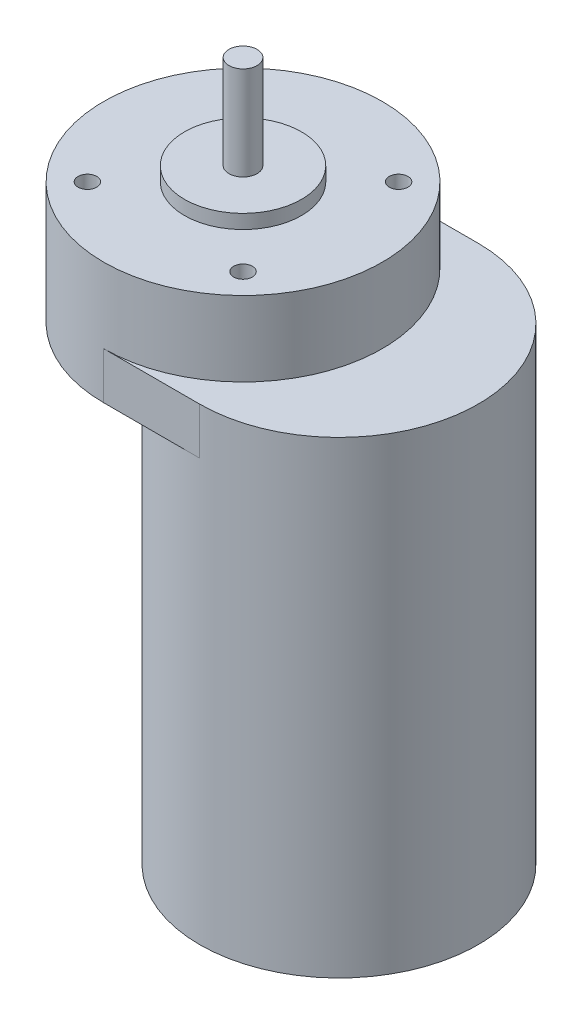
ISO-10303-21;
HEADER;
FILE_DESCRIPTION(('STEP AP214'),'2;1');
FILE_NAME('part.step','',(''),(''),'','','');
FILE_SCHEMA(('AUTOMOTIVE_DESIGN { 1 0 10303 214 1 1 1 1 }'));
ENDSEC;
DATA;
#1=APPLICATION_CONTEXT('core data for automotive mechanical design processes');
#2=APPLICATION_PROTOCOL_DEFINITION('international standard','automotive_design',2000,#1);
#3=PRODUCT_CONTEXT('',#1,'mechanical');
#4=PRODUCT('Part','Part','',(#3));
#5=PRODUCT_RELATED_PRODUCT_CATEGORY('part','',(#4));
#6=PRODUCT_DEFINITION_FORMATION('','',#4);
#7=PRODUCT_DEFINITION_CONTEXT('part definition',#1,'design');
#8=PRODUCT_DEFINITION('design','',#6,#7);
#9=PRODUCT_DEFINITION_SHAPE('','',#8);
#10=(LENGTH_UNIT() NAMED_UNIT(*) SI_UNIT(.MILLI.,.METRE.));
#11=(NAMED_UNIT(*) PLANE_ANGLE_UNIT() SI_UNIT($,.RADIAN.));
#12=(NAMED_UNIT(*) SI_UNIT($,.STERADIAN.) SOLID_ANGLE_UNIT());
#13=UNCERTAINTY_MEASURE_WITH_UNIT(LENGTH_MEASURE(1.E-05),#10,'distance_accuracy_value','');
#14=(GEOMETRIC_REPRESENTATION_CONTEXT(3) GLOBAL_UNCERTAINTY_ASSIGNED_CONTEXT((#13)) GLOBAL_UNIT_ASSIGNED_CONTEXT((#10,
#11,#12)) REPRESENTATION_CONTEXT('',''));
#15=CARTESIAN_POINT('',(0.,0.,0.));
#16=DIRECTION('',(0.,0.,1.));
#17=DIRECTION('',(1.,0.,0.));
#18=AXIS2_PLACEMENT_3D('',#15,#16,#17);
#19=CARTESIAN_POINT('',(-20.5,139.,0.));
#20=DIRECTION('',(0.,-1.,0.));
#21=DIRECTION('',(0.,0.,-1.));
#22=AXIS2_PLACEMENT_3D('',#19,#20,#21);
#23=CYLINDRICAL_SURFACE('',#22,3.);
#24=CARTESIAN_POINT('',(-20.5,139.,0.));
#25=DIRECTION('',(0.,1.,0.));
#26=DIRECTION('',(0.,0.,1.));
#27=AXIS2_PLACEMENT_3D('',#24,#25,#26);
#28=CIRCLE('',#27,3.);
#29=CARTESIAN_POINT('',(-20.5,139.,2.99999999999999));
#30=VERTEX_POINT('',#29);
#31=EDGE_CURVE('E11',#30,#30,#28,.T.);
#32=ORIENTED_EDGE('',*,*,#31,.F.);
#33=EDGE_LOOP('',(#32));
#34=FACE_BOUND('',#33,.T.);
#35=CARTESIAN_POINT('',(-20.5,119.,0.));
#36=DIRECTION('',(0.,1.,0.));
#37=DIRECTION('',(0.,0.,1.));
#38=AXIS2_PLACEMENT_3D('',#35,#36,#37);
#39=CIRCLE('',#38,3.);
#40=CARTESIAN_POINT('',(-20.5,119.,2.99999999999999));
#41=VERTEX_POINT('',#40);
#42=EDGE_CURVE('E49',#41,#41,#39,.T.);
#43=ORIENTED_EDGE('',*,*,#42,.T.);
#44=EDGE_LOOP('',(#43));
#45=FACE_BOUND('',#44,.T.);
#46=ADVANCED_FACE('F46',(#34,#45),#23,.T.);
#47=CARTESIAN_POINT('',(-20.5,139.,0.));
#48=DIRECTION('',(0.,1.,0.));
#49=DIRECTION('',(0.,0.,1.));
#50=AXIS2_PLACEMENT_3D('',#47,#48,#49);
#51=PLANE('',#50);
#52=ORIENTED_EDGE('',*,*,#31,.T.);
#53=EDGE_LOOP('',(#52));
#54=FACE_BOUND('',#53,.T.);
#55=ADVANCED_FACE('F61',(#54),#51,.T.);
#56=CARTESIAN_POINT('',(-20.5,119.,0.));
#57=DIRECTION('',(0.,1.,0.));
#58=DIRECTION('',(0.,0.,1.));
#59=AXIS2_PLACEMENT_3D('',#56,#57,#58);
#60=PLANE('',#59);
#61=ORIENTED_EDGE('',*,*,#42,.F.);
#62=EDGE_LOOP('',(#61));
#63=FACE_BOUND('',#62,.T.);
#64=ADVANCED_FACE('F59',(#63),#60,.F.);
#65=CLOSED_SHELL('',(#46,#55,#64));
#66=MANIFOLD_SOLID_BREP('B2',#65);
#67=CARTESIAN_POINT('',(0.,90.,0.));
#68=DIRECTION('',(0.,-1.,0.));
#69=DIRECTION('',(0.,0.,-1.));
#70=AXIS2_PLACEMENT_3D('',#67,#68,#69);
#71=CYLINDRICAL_SURFACE('',#70,29.75);
#72=CARTESIAN_POINT('',(0.,90.,0.));
#73=DIRECTION('',(0.,1.,0.));
#74=DIRECTION('',(0.,0.,1.));
#75=AXIS2_PLACEMENT_3D('',#72,#73,#74);
#76=CIRCLE('',#75,29.75);
#77=CARTESIAN_POINT('',(0.,90.,-29.75));
#78=VERTEX_POINT('',#77);
#79=CARTESIAN_POINT('',(0.,90.,29.75));
#80=VERTEX_POINT('',#79);
#81=EDGE_CURVE('E94',#78,#80,#76,.T.);
#82=ORIENTED_EDGE('',*,*,#81,.F.);
#83=DIRECTION('',(0.,-1.,0.));
#84=VECTOR('',#83,1.);
#85=CARTESIAN_POINT('',(0.,100.,-29.75));
#86=LINE('',#85,#84);
#87=CARTESIAN_POINT('',(0.,100.,-29.75));
#88=VERTEX_POINT('',#87);
#89=EDGE_CURVE('E171',#88,#78,#86,.T.);
#90=ORIENTED_EDGE('',*,*,#89,.F.);
#91=CARTESIAN_POINT('',(0.,100.,0.));
#92=DIRECTION('',(0.,1.,0.));
#93=DIRECTION('',(0.,0.,1.));
#94=AXIS2_PLACEMENT_3D('',#91,#92,#93);
#95=CIRCLE('',#94,29.75);
#96=CARTESIAN_POINT('',(0.,100.,29.75));
#97=VERTEX_POINT('',#96);
#98=EDGE_CURVE('E162',#97,#88,#95,.T.);
#99=ORIENTED_EDGE('',*,*,#98,.F.);
#100=DIRECTION('',(0.,-1.,0.));
#101=VECTOR('',#100,1.);
#102=CARTESIAN_POINT('',(0.,100.,29.75));
#103=LINE('',#102,#101);
#104=EDGE_CURVE('E138',#97,#80,#103,.T.);
#105=ORIENTED_EDGE('',*,*,#104,.T.);
#106=EDGE_LOOP('',(#82,#90,#99,#105));
#107=FACE_BOUND('',#106,.T.);
#108=CARTESIAN_POINT('',(0.,0.,0.));
#109=DIRECTION('',(0.,1.,0.));
#110=DIRECTION('',(0.,0.,1.));
#111=AXIS2_PLACEMENT_3D('',#108,#109,#110);
#112=CIRCLE('',#111,29.75);
#113=CARTESIAN_POINT('',(0.,0.,29.75));
#114=VERTEX_POINT('',#113);
#115=EDGE_CURVE('E89',#114,#114,#112,.T.);
#116=ORIENTED_EDGE('',*,*,#115,.T.);
#117=EDGE_LOOP('',(#116));
#118=FACE_BOUND('',#117,.T.);
#119=ADVANCED_FACE('F86',(#107,#118),#71,.T.);
#120=CARTESIAN_POINT('',(0.,0.,0.));
#121=DIRECTION('',(0.,1.,0.));
#122=DIRECTION('',(0.,0.,1.));
#123=AXIS2_PLACEMENT_3D('',#120,#121,#122);
#124=PLANE('',#123);
#125=ORIENTED_EDGE('',*,*,#115,.F.);
#126=EDGE_LOOP('',(#125));
#127=FACE_BOUND('',#126,.T.);
#128=ADVANCED_FACE('F176',(#127),#124,.F.);
#129=CARTESIAN_POINT('',(0.,90.,0.));
#130=DIRECTION('',(0.,1.,0.));
#131=DIRECTION('',(0.,0.,1.));
#132=AXIS2_PLACEMENT_3D('',#129,#130,#131);
#133=PLANE('',#132);
#134=DIRECTION('',(-1.,0.,0.));
#135=VECTOR('',#134,1.);
#136=CARTESIAN_POINT('',(0.,90.,-29.75));
#137=LINE('',#136,#135);
#138=CARTESIAN_POINT('',(-20.5,90.,-29.75));
#139=VERTEX_POINT('',#138);
#140=EDGE_CURVE('E156',#78,#139,#137,.T.);
#141=ORIENTED_EDGE('',*,*,#140,.F.);
#142=ORIENTED_EDGE('',*,*,#81,.T.);
#143=DIRECTION('',(1.,0.,0.));
#144=VECTOR('',#143,1.);
#145=CARTESIAN_POINT('',(0.,90.,29.75));
#146=LINE('',#145,#144);
#147=CARTESIAN_POINT('',(-20.5,90.,29.75));
#148=VERTEX_POINT('',#147);
#149=EDGE_CURVE('E164',#148,#80,#146,.T.);
#150=ORIENTED_EDGE('',*,*,#149,.F.);
#151=CARTESIAN_POINT('',(-20.5,90.,0.));
#152=DIRECTION('',(0.,1.,0.));
#153=DIRECTION('',(0.,0.,1.));
#154=AXIS2_PLACEMENT_3D('',#151,#152,#153);
#155=CIRCLE('',#154,29.75);
#156=EDGE_CURVE('E148',#139,#148,#155,.T.);
#157=ORIENTED_EDGE('',*,*,#156,.F.);
#158=EDGE_LOOP('',(#141,#142,#150,#157));
#159=FACE_BOUND('',#158,.T.);
#160=ADVANCED_FACE('F178',(#159),#133,.F.);
#161=CARTESIAN_POINT('',(0.,100.,-29.75));
#162=DIRECTION('',(0.,0.,1.));
#163=DIRECTION('',(1.,0.,0.));
#164=AXIS2_PLACEMENT_3D('',#161,#162,#163);
#165=PLANE('',#164);
#166=ORIENTED_EDGE('',*,*,#140,.T.);
#167=DIRECTION('',(0.,-1.,0.));
#168=VECTOR('',#167,1.);
#169=CARTESIAN_POINT('',(-20.5,100.,-29.75));
#170=LINE('',#169,#168);
#171=CARTESIAN_POINT('',(-20.5,100.,-29.75));
#172=VERTEX_POINT('',#171);
#173=EDGE_CURVE('E149',#172,#139,#170,.T.);
#174=ORIENTED_EDGE('',*,*,#173,.F.);
#175=DIRECTION('',(-1.,0.,0.));
#176=VECTOR('',#175,1.);
#177=CARTESIAN_POINT('',(0.,100.,-29.75));
#178=LINE('',#177,#176);
#179=EDGE_CURVE('E131',#88,#172,#178,.T.);
#180=ORIENTED_EDGE('',*,*,#179,.F.);
#181=ORIENTED_EDGE('',*,*,#89,.T.);
#182=EDGE_LOOP('',(#166,#174,#180,#181));
#183=FACE_BOUND('',#182,.T.);
#184=ADVANCED_FACE('F183',(#183),#165,.F.);
#185=CARTESIAN_POINT('',(-20.5,100.,0.));
#186=DIRECTION('',(0.,-1.,0.));
#187=DIRECTION('',(0.,0.,-1.));
#188=AXIS2_PLACEMENT_3D('',#185,#186,#187);
#189=CYLINDRICAL_SURFACE('',#188,29.75);
#190=ORIENTED_EDGE('',*,*,#156,.T.);
#191=DIRECTION('',(0.,-1.,0.));
#192=VECTOR('',#191,1.);
#193=CARTESIAN_POINT('',(-20.5,100.,29.75));
#194=LINE('',#193,#192);
#195=CARTESIAN_POINT('',(-20.5,100.,29.75));
#196=VERTEX_POINT('',#195);
#197=EDGE_CURVE('E137',#196,#148,#194,.T.);
#198=ORIENTED_EDGE('',*,*,#197,.F.);
#199=CARTESIAN_POINT('',(-20.5,100.,0.));
#200=DIRECTION('',(0.,1.,0.));
#201=DIRECTION('',(0.,0.,1.));
#202=AXIS2_PLACEMENT_3D('',#199,#200,#201);
#203=CIRCLE('',#202,29.75);
#204=EDGE_CURVE('E146',#196,#172,#203,.T.);
#205=ORIENTED_EDGE('',*,*,#204,.T.);
#206=ORIENTED_EDGE('',*,*,#173,.T.);
#207=EDGE_LOOP('',(#190,#198,#205,#206));
#208=FACE_BOUND('',#207,.T.);
#209=CARTESIAN_POINT('',(-20.5,116.,0.));
#210=DIRECTION('',(0.,1.,0.));
#211=DIRECTION('',(0.,0.,1.));
#212=AXIS2_PLACEMENT_3D('',#209,#210,#211);
#213=CIRCLE('',#212,29.75);
#214=CARTESIAN_POINT('',(-20.5,116.,29.75));
#215=VERTEX_POINT('',#214);
#216=EDGE_CURVE('E152',#215,#215,#213,.T.);
#217=ORIENTED_EDGE('',*,*,#216,.F.);
#218=EDGE_LOOP('',(#217));
#219=FACE_BOUND('',#218,.T.);
#220=ADVANCED_FACE('F143',(#208,#219),#189,.T.);
#221=CARTESIAN_POINT('',(0.,100.,29.75));
#222=DIRECTION('',(0.,0.,-1.));
#223=DIRECTION('',(-1.,0.,0.));
#224=AXIS2_PLACEMENT_3D('',#221,#222,#223);
#225=PLANE('',#224);
#226=ORIENTED_EDGE('',*,*,#149,.T.);
#227=ORIENTED_EDGE('',*,*,#104,.F.);
#228=DIRECTION('',(1.,0.,0.));
#229=VECTOR('',#228,1.);
#230=CARTESIAN_POINT('',(0.,100.,29.75));
#231=LINE('',#230,#229);
#232=EDGE_CURVE('E110',#196,#97,#231,.T.);
#233=ORIENTED_EDGE('',*,*,#232,.F.);
#234=ORIENTED_EDGE('',*,*,#197,.T.);
#235=EDGE_LOOP('',(#226,#227,#233,#234));
#236=FACE_BOUND('',#235,.T.);
#237=ADVANCED_FACE('F136',(#236),#225,.F.);
#238=CARTESIAN_POINT('',(0.,100.,0.));
#239=DIRECTION('',(0.,1.,0.));
#240=DIRECTION('',(0.,0.,1.));
#241=AXIS2_PLACEMENT_3D('',#238,#239,#240);
#242=PLANE('',#241);
#243=ORIENTED_EDGE('',*,*,#204,.F.);
#244=ORIENTED_EDGE('',*,*,#232,.T.);
#245=ORIENTED_EDGE('',*,*,#98,.T.);
#246=ORIENTED_EDGE('',*,*,#179,.T.);
#247=EDGE_LOOP('',(#243,#244,#245,#246));
#248=FACE_BOUND('',#247,.T.);
#249=ADVANCED_FACE('F151',(#248),#242,.T.);
#250=CARTESIAN_POINT('',(-20.5,116.,0.));
#251=DIRECTION('',(0.,1.,0.));
#252=DIRECTION('',(0.,0.,1.));
#253=AXIS2_PLACEMENT_3D('',#250,#251,#252);
#254=PLANE('',#253);
#255=CARTESIAN_POINT('',(-3.88299064211628,116.,-16.6170093578845));
#256=DIRECTION('',(0.,1.,0.));
#257=DIRECTION('',(0.,0.,1.));
#258=AXIS2_PLACEMENT_3D('',#255,#256,#257);
#259=CIRCLE('',#258,2.);
#260=CARTESIAN_POINT('',(-3.88299064211628,116.,-14.6170093578845));
#261=VERTEX_POINT('',#260);
#262=EDGE_CURVE('E265',#261,#261,#259,.T.);
#263=ORIENTED_EDGE('',*,*,#262,.F.);
#264=EDGE_LOOP('',(#263));
#265=FACE_BOUND('',#264,.T.);
#266=CARTESIAN_POINT('',(-3.88299064211558,116.,16.6170093578833));
#267=DIRECTION('',(0.,1.,0.));
#268=DIRECTION('',(0.,0.,1.));
#269=AXIS2_PLACEMENT_3D('',#266,#267,#268);
#270=CIRCLE('',#269,2.00000000000001);
#271=CARTESIAN_POINT('',(-3.88299064211558,116.,18.6170093578833));
#272=VERTEX_POINT('',#271);
#273=EDGE_CURVE('E259',#272,#272,#270,.T.);
#274=ORIENTED_EDGE('',*,*,#273,.F.);
#275=EDGE_LOOP('',(#274));
#276=FACE_BOUND('',#275,.T.);
#277=CARTESIAN_POINT('',(-37.1170093578834,116.,16.6170093578839));
#278=DIRECTION('',(0.,1.,0.));
#279=DIRECTION('',(0.,0.,1.));
#280=AXIS2_PLACEMENT_3D('',#277,#278,#279);
#281=CIRCLE('',#280,2.);
#282=CARTESIAN_POINT('',(-37.1170093578834,116.,18.6170093578839));
#283=VERTEX_POINT('',#282);
#284=EDGE_CURVE('E248',#283,#283,#281,.T.);
#285=ORIENTED_EDGE('',*,*,#284,.F.);
#286=EDGE_LOOP('',(#285));
#287=FACE_BOUND('',#286,.T.);
#288=CARTESIAN_POINT('',(-37.1170093578838,116.,-16.6170093578839));
#289=DIRECTION('',(0.,1.,0.));
#290=DIRECTION('',(0.,0.,1.));
#291=AXIS2_PLACEMENT_3D('',#288,#289,#290);
#292=CIRCLE('',#291,2.);
#293=CARTESIAN_POINT('',(-37.1170093578838,116.,-14.6170093578839));
#294=VERTEX_POINT('',#293);
#295=EDGE_CURVE('E247',#294,#294,#292,.T.);
#296=ORIENTED_EDGE('',*,*,#295,.F.);
#297=EDGE_LOOP('',(#296));
#298=FACE_BOUND('',#297,.T.);
#299=CARTESIAN_POINT('',(-20.5,116.,0.));
#300=DIRECTION('',(0.,1.,0.));
#301=DIRECTION('',(0.,0.,1.));
#302=AXIS2_PLACEMENT_3D('',#299,#300,#301);
#303=CIRCLE('',#302,12.5);
#304=CARTESIAN_POINT('',(-20.5,116.,12.5));
#305=VERTEX_POINT('',#304);
#306=EDGE_CURVE('E44',#305,#305,#303,.T.);
#307=ORIENTED_EDGE('',*,*,#306,.F.);
#308=EDGE_LOOP('',(#307));
#309=FACE_BOUND('',#308,.T.);
#310=ORIENTED_EDGE('',*,*,#216,.T.);
#311=EDGE_LOOP('',(#310));
#312=FACE_BOUND('',#311,.T.);
#313=ADVANCED_FACE('F194',(#265,#276,#287,#298,#309,#312),#254,.T.);
#314=CARTESIAN_POINT('',(-20.5,119.,0.));
#315=DIRECTION('',(0.,1.,0.));
#316=DIRECTION('',(0.,0.,1.));
#317=AXIS2_PLACEMENT_3D('',#314,#315,#316);
#318=PLANE('',#317);
#319=CARTESIAN_POINT('',(-20.5,119.,0.));
#320=DIRECTION('',(0.,1.,0.));
#321=DIRECTION('',(0.,0.,1.));
#322=AXIS2_PLACEMENT_3D('',#319,#320,#321);
#323=CIRCLE('',#322,12.5);
#324=CARTESIAN_POINT('',(-20.5,119.,12.5));
#325=VERTEX_POINT('',#324);
#326=EDGE_CURVE('E153',#325,#325,#323,.T.);
#327=ORIENTED_EDGE('',*,*,#326,.T.);
#328=EDGE_LOOP('',(#327));
#329=FACE_BOUND('',#328,.T.);
#330=CARTESIAN_POINT('',(-20.5,119.,0.));
#331=DIRECTION('',(0.,1.,0.));
#332=DIRECTION('',(0.,0.,1.));
#333=AXIS2_PLACEMENT_3D('',#330,#331,#332);
#334=CIRCLE('',#333,3.);
#335=CARTESIAN_POINT('',(-20.5,119.,2.99999999999999));
#336=VERTEX_POINT('',#335);
#337=EDGE_CURVE('E159',#336,#336,#334,.T.);
#338=ORIENTED_EDGE('',*,*,#337,.F.);
#339=EDGE_LOOP('',(#338));
#340=FACE_BOUND('',#339,.T.);
#341=ADVANCED_FACE('F197',(#329,#340),#318,.T.);
#342=CARTESIAN_POINT('',(-20.5,119.,0.));
#343=DIRECTION('',(0.,-1.,0.));
#344=DIRECTION('',(0.,0.,-1.));
#345=AXIS2_PLACEMENT_3D('',#342,#343,#344);
#346=CYLINDRICAL_SURFACE('',#345,12.5);
#347=ORIENTED_EDGE('',*,*,#326,.F.);
#348=EDGE_LOOP('',(#347));
#349=FACE_BOUND('',#348,.T.);
#350=ORIENTED_EDGE('',*,*,#306,.T.);
#351=EDGE_LOOP('',(#350));
#352=FACE_BOUND('',#351,.T.);
#353=ADVANCED_FACE('F200',(#349,#352),#346,.T.);
#354=CARTESIAN_POINT('',(-20.5,119.,0.));
#355=DIRECTION('',(0.,-1.,0.));
#356=DIRECTION('',(0.,0.,-1.));
#357=AXIS2_PLACEMENT_3D('',#354,#355,#356);
#358=CYLINDRICAL_SURFACE('',#357,3.);
#359=ORIENTED_EDGE('',*,*,#337,.T.);
#360=EDGE_LOOP('',(#359));
#361=FACE_BOUND('',#360,.T.);
#362=CARTESIAN_POINT('',(-20.5,116.,0.));
#363=DIRECTION('',(0.,1.,0.));
#364=DIRECTION('',(0.,0.,1.));
#365=AXIS2_PLACEMENT_3D('',#362,#363,#364);
#366=CIRCLE('',#365,3.);
#367=CARTESIAN_POINT('',(-20.5,116.,2.99999999999999));
#368=VERTEX_POINT('',#367);
#369=EDGE_CURVE('E269',#368,#368,#366,.T.);
#370=ORIENTED_EDGE('',*,*,#369,.F.);
#371=EDGE_LOOP('',(#370));
#372=FACE_BOUND('',#371,.T.);
#373=ADVANCED_FACE('F203',(#361,#372),#358,.F.);
#374=ORIENTED_EDGE('',*,*,#369,.T.);
#375=EDGE_LOOP('',(#374));
#376=FACE_BOUND('',#375,.T.);
#377=ADVANCED_FACE('F199',(#376),#254,.T.);
#378=CARTESIAN_POINT('',(-37.1170093578838,96.,-16.6170093578839));
#379=DIRECTION('',(0.,1.,0.));
#380=DIRECTION('',(0.,0.,1.));
#381=AXIS2_PLACEMENT_3D('',#378,#379,#380);
#382=CYLINDRICAL_SURFACE('',#381,2.);
#383=CARTESIAN_POINT('',(-37.1170093578838,96.,-16.6170093578839));
#384=DIRECTION('',(0.,1.,0.));
#385=DIRECTION('',(0.,0.,1.));
#386=AXIS2_PLACEMENT_3D('',#383,#384,#385);
#387=CIRCLE('',#386,2.);
#388=CARTESIAN_POINT('',(-37.1170093578838,96.,-14.6170093578839));
#389=VERTEX_POINT('',#388);
#390=EDGE_CURVE('E251',#389,#389,#387,.T.);
#391=ORIENTED_EDGE('',*,*,#390,.F.);
#392=EDGE_LOOP('',(#391));
#393=FACE_BOUND('',#392,.T.);
#394=ORIENTED_EDGE('',*,*,#295,.T.);
#395=EDGE_LOOP('',(#394));
#396=FACE_BOUND('',#395,.T.);
#397=ADVANCED_FACE('F211',(#393,#396),#382,.F.);
#398=CARTESIAN_POINT('',(-37.1170093578838,96.,-16.6170093578839));
#399=DIRECTION('',(0.,1.,0.));
#400=DIRECTION('',(0.,0.,1.));
#401=AXIS2_PLACEMENT_3D('',#398,#399,#400);
#402=PLANE('',#401);
#403=ORIENTED_EDGE('',*,*,#390,.T.);
#404=EDGE_LOOP('',(#403));
#405=FACE_BOUND('',#404,.T.);
#406=ADVANCED_FACE('F214',(#405),#402,.T.);
#407=CARTESIAN_POINT('',(-37.1170093578834,96.,16.6170093578839));
#408=DIRECTION('',(0.,1.,0.));
#409=DIRECTION('',(0.,0.,1.));
#410=AXIS2_PLACEMENT_3D('',#407,#408,#409);
#411=CYLINDRICAL_SURFACE('',#410,2.);
#412=CARTESIAN_POINT('',(-37.1170093578834,96.,16.6170093578839));
#413=DIRECTION('',(0.,1.,0.));
#414=DIRECTION('',(0.,0.,1.));
#415=AXIS2_PLACEMENT_3D('',#412,#413,#414);
#416=CIRCLE('',#415,2.);
#417=CARTESIAN_POINT('',(-37.1170093578834,96.,18.6170093578839));
#418=VERTEX_POINT('',#417);
#419=EDGE_CURVE('E246',#418,#418,#416,.T.);
#420=ORIENTED_EDGE('',*,*,#419,.F.);
#421=EDGE_LOOP('',(#420));
#422=FACE_BOUND('',#421,.T.);
#423=ORIENTED_EDGE('',*,*,#284,.T.);
#424=EDGE_LOOP('',(#423));
#425=FACE_BOUND('',#424,.T.);
#426=ADVANCED_FACE('F218',(#422,#425),#411,.F.);
#427=CARTESIAN_POINT('',(-37.1170093578834,96.,16.6170093578839));
#428=DIRECTION('',(0.,1.,0.));
#429=DIRECTION('',(0.,0.,1.));
#430=AXIS2_PLACEMENT_3D('',#427,#428,#429);
#431=PLANE('',#430);
#432=ORIENTED_EDGE('',*,*,#419,.T.);
#433=EDGE_LOOP('',(#432));
#434=FACE_BOUND('',#433,.T.);
#435=ADVANCED_FACE('F232',(#434),#431,.T.);
#436=CARTESIAN_POINT('',(-3.88299064211558,96.,16.6170093578833));
#437=DIRECTION('',(0.,1.,0.));
#438=DIRECTION('',(0.,0.,1.));
#439=AXIS2_PLACEMENT_3D('',#436,#437,#438);
#440=CYLINDRICAL_SURFACE('',#439,2.00000000000001);
#441=CARTESIAN_POINT('',(-3.88299064211558,96.,16.6170093578833));
#442=DIRECTION('',(0.,1.,0.));
#443=DIRECTION('',(0.,0.,1.));
#444=AXIS2_PLACEMENT_3D('',#441,#442,#443);
#445=CIRCLE('',#444,2.00000000000001);
#446=CARTESIAN_POINT('',(-3.88299064211558,96.,18.6170093578833));
#447=VERTEX_POINT('',#446);
#448=EDGE_CURVE('E254',#447,#447,#445,.T.);
#449=ORIENTED_EDGE('',*,*,#448,.F.);
#450=EDGE_LOOP('',(#449));
#451=FACE_BOUND('',#450,.T.);
#452=ORIENTED_EDGE('',*,*,#273,.T.);
#453=EDGE_LOOP('',(#452));
#454=FACE_BOUND('',#453,.T.);
#455=ADVANCED_FACE('F229',(#451,#454),#440,.F.);
#456=CARTESIAN_POINT('',(-3.88299064211558,96.,16.6170093578833));
#457=DIRECTION('',(0.,1.,0.));
#458=DIRECTION('',(0.,0.,1.));
#459=AXIS2_PLACEMENT_3D('',#456,#457,#458);
#460=PLANE('',#459);
#461=ORIENTED_EDGE('',*,*,#448,.T.);
#462=EDGE_LOOP('',(#461));
#463=FACE_BOUND('',#462,.T.);
#464=ADVANCED_FACE('F224',(#463),#460,.T.);
#465=CARTESIAN_POINT('',(-3.88299064211628,96.,-16.6170093578845));
#466=DIRECTION('',(0.,1.,0.));
#467=DIRECTION('',(0.,0.,1.));
#468=AXIS2_PLACEMENT_3D('',#465,#466,#467);
#469=CYLINDRICAL_SURFACE('',#468,2.);
#470=CARTESIAN_POINT('',(-3.88299064211628,96.,-16.6170093578845));
#471=DIRECTION('',(0.,1.,0.));
#472=DIRECTION('',(0.,0.,1.));
#473=AXIS2_PLACEMENT_3D('',#470,#471,#472);
#474=CIRCLE('',#473,2.);
#475=CARTESIAN_POINT('',(-3.88299064211628,96.,-14.6170093578845));
#476=VERTEX_POINT('',#475);
#477=EDGE_CURVE('E262',#476,#476,#474,.T.);
#478=ORIENTED_EDGE('',*,*,#477,.F.);
#479=EDGE_LOOP('',(#478));
#480=FACE_BOUND('',#479,.T.);
#481=ORIENTED_EDGE('',*,*,#262,.T.);
#482=EDGE_LOOP('',(#481));
#483=FACE_BOUND('',#482,.T.);
#484=ADVANCED_FACE('F220',(#480,#483),#469,.F.);
#485=CARTESIAN_POINT('',(-3.88299064211628,96.,-16.6170093578845));
#486=DIRECTION('',(0.,1.,0.));
#487=DIRECTION('',(0.,0.,1.));
#488=AXIS2_PLACEMENT_3D('',#485,#486,#487);
#489=PLANE('',#488);
#490=ORIENTED_EDGE('',*,*,#477,.T.);
#491=EDGE_LOOP('',(#490));
#492=FACE_BOUND('',#491,.T.);
#493=ADVANCED_FACE('F223',(#492),#489,.T.);
#494=CLOSED_SHELL('',(#119,#128,#160,#184,#220,#237,#249,#313,#341,#353,#373,#377,#397,#406,
#426,#435,#455,#464,#484,#493));
#495=MANIFOLD_SOLID_BREP('B6',#494);
#496=ADVANCED_BREP_SHAPE_REPRESENTATION('',(#18,#66,#495),#14);
#497=SHAPE_DEFINITION_REPRESENTATION(#9,#496);
ENDSEC;
END-ISO-10303-21;
